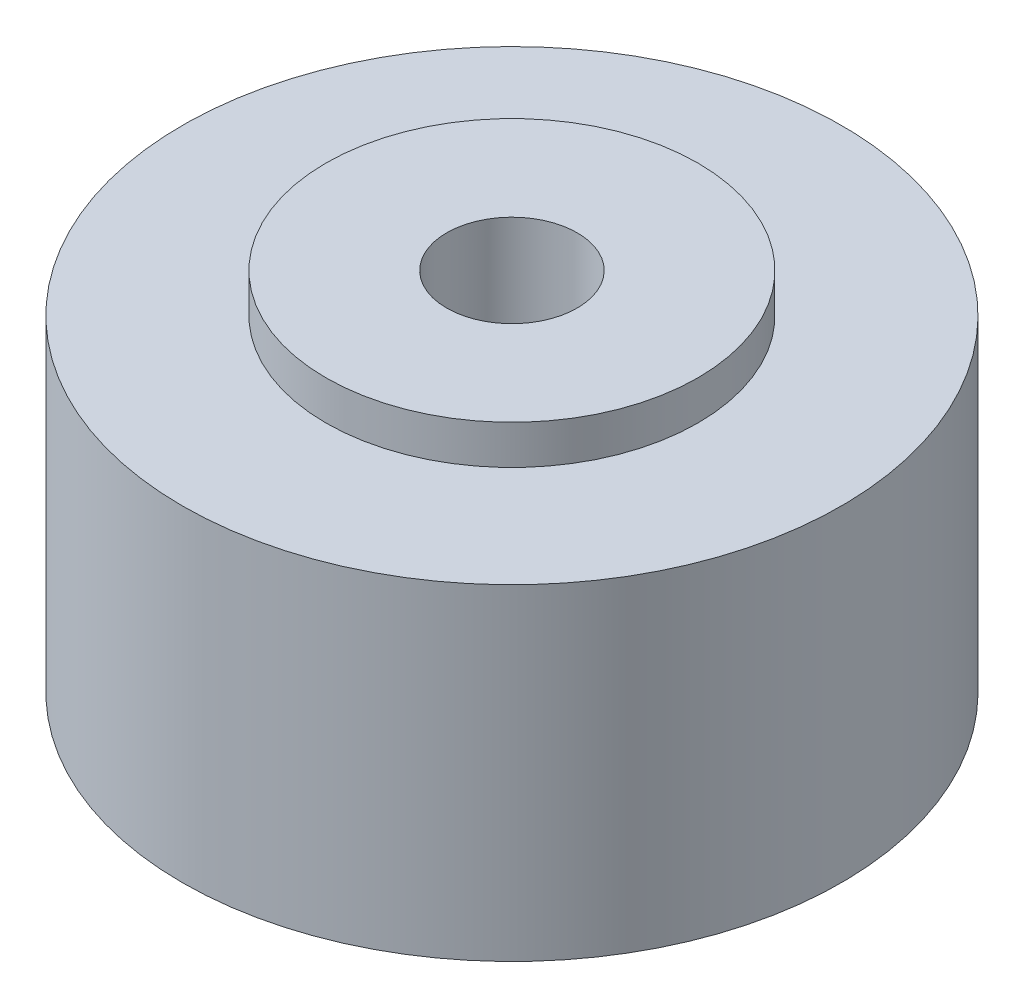
ISO-10303-21;
HEADER;
FILE_DESCRIPTION(('STEP AP214'),'2;1');
FILE_NAME('part.step','',(''),(''),'','','');
FILE_SCHEMA(('AUTOMOTIVE_DESIGN { 1 0 10303 214 1 1 1 1 }'));
ENDSEC;
DATA;
#1=APPLICATION_CONTEXT('core data for automotive mechanical design processes');
#2=APPLICATION_PROTOCOL_DEFINITION('international standard','automotive_design',2000,#1);
#3=PRODUCT_CONTEXT('',#1,'mechanical');
#4=PRODUCT('Part','Part','',(#3));
#5=PRODUCT_RELATED_PRODUCT_CATEGORY('part','',(#4));
#6=PRODUCT_DEFINITION_FORMATION('','',#4);
#7=PRODUCT_DEFINITION_CONTEXT('part definition',#1,'design');
#8=PRODUCT_DEFINITION('design','',#6,#7);
#9=PRODUCT_DEFINITION_SHAPE('','',#8);
#10=(LENGTH_UNIT() NAMED_UNIT(*) SI_UNIT(.MILLI.,.METRE.));
#11=(NAMED_UNIT(*) PLANE_ANGLE_UNIT() SI_UNIT($,.RADIAN.));
#12=(NAMED_UNIT(*) SI_UNIT($,.STERADIAN.) SOLID_ANGLE_UNIT());
#13=UNCERTAINTY_MEASURE_WITH_UNIT(LENGTH_MEASURE(1.E-05),#10,'distance_accuracy_value','');
#14=(GEOMETRIC_REPRESENTATION_CONTEXT(3) GLOBAL_UNCERTAINTY_ASSIGNED_CONTEXT((#13)) GLOBAL_UNIT_ASSIGNED_CONTEXT((#10,
#11,#12)) REPRESENTATION_CONTEXT('',''));
#15=CARTESIAN_POINT('',(0.,0.,0.));
#16=DIRECTION('',(0.,0.,1.));
#17=DIRECTION('',(1.,0.,0.));
#18=AXIS2_PLACEMENT_3D('',#15,#16,#17);
#19=CARTESIAN_POINT('',(0.,0.,0.));
#20=DIRECTION('',(0.,1.,0.));
#21=DIRECTION('',(-1.,0.,0.));
#22=AXIS2_PLACEMENT_3D('',#19,#20,#21);
#23=SPHERICAL_SURFACE('',#22,25.25);
#24=CARTESIAN_POINT('',(0.,24.75,0.));
#25=DIRECTION('',(0.,1.,0.));
#26=DIRECTION('',(0.,0.,1.));
#27=AXIS2_PLACEMENT_3D('',#24,#25,#26);
#28=CIRCLE('',#27,5.);
#29=CARTESIAN_POINT('',(-5.00000000000005,24.75,0.));
#30=VERTEX_POINT('',#29);
#31=EDGE_CURVE('E10',#30,#30,#28,.T.);
#32=CARTESIAN_POINT('',(0.,10.,0.));
#33=DIRECTION('',(0.,1.,0.));
#34=DIRECTION('',(0.,0.,1.));
#35=AXIS2_PLACEMENT_3D('',#32,#33,#34);
#36=CIRCLE('',#35,23.1853941092232);
#37=CARTESIAN_POINT('',(-23.1853941092232,10.,0.));
#38=VERTEX_POINT('',#37);
#39=EDGE_CURVE('E56',#38,#38,#36,.T.);
#40=CARTESIAN_POINT('',(-5.00000000000005,24.75,0.));
#41=CARTESIAN_POINT('',(-5.24859837494411,24.6997793766757,0.));
#42=CARTESIAN_POINT('',(-5.49643953186399,24.6458108524926,0.));
#43=CARTESIAN_POINT('',(-5.99038363063619,24.5304323309131,0.));
#44=CARTESIAN_POINT('',(-6.2364865724885,24.4690223335168,0.));
#45=CARTESIAN_POINT('',(-6.72673046210632,24.3388151940155,0.));
#46=CARTESIAN_POINT('',(-6.97087140987183,24.2700180519107,0.));
#47=CARTESIAN_POINT('',(-7.45696973653403,24.1250994689104,0.));
#48=CARTESIAN_POINT('',(-7.69892711543071,24.048978028015,0.));
#49=CARTESIAN_POINT('',(-8.18043859880342,23.8894798582542,0.));
#50=CARTESIAN_POINT('',(-8.41999270327945,23.8061031293888,0.));
#51=CARTESIAN_POINT('',(-8.8964801446373,23.6321701118176,0.));
#52=CARTESIAN_POINT('',(-9.13341348151913,23.5416138231119,0.));
#53=CARTESIAN_POINT('',(-9.60444426586683,23.3534038977369,0.));
#54=CARTESIAN_POINT('',(-9.8385417133327,23.2557502610677,0.));
#55=CARTESIAN_POINT('',(-10.3036881740102,23.0534343049062,0.));
#56=CARTESIAN_POINT('',(-10.5347371872218,22.9487719854138,0.));
#57=CARTESIAN_POINT('',(-10.9935770017491,22.7325336896755,0.));
#58=CARTESIAN_POINT('',(-11.2213678030647,22.6209577134295,0.));
#59=CARTESIAN_POINT('',(-11.6734843745598,22.3909934080751,0.));
#60=CARTESIAN_POINT('',(-11.8978101447392,22.2726050789667,0.));
#61=CARTESIAN_POINT('',(-12.3427929807033,22.0291235567738,0.));
#62=CARTESIAN_POINT('',(-12.5634500464879,21.9040303636893,0.));
#63=CARTESIAN_POINT('',(-13.0008951313607,21.6472526900602,0.));
#64=CARTESIAN_POINT('',(-13.2176831504488,21.5155682095157,0.));
#65=CARTESIAN_POINT('',(-13.6471933124673,21.2457275219312,0.));
#66=CARTESIAN_POINT('',(-13.8599154553976,21.1075713148913,0.));
#67=CARTESIAN_POINT('',(-14.2811007271919,20.8249126111921,0.));
#68=CARTESIAN_POINT('',(-14.4895638560558,20.6804101145328,0.));
#69=CARTESIAN_POINT('',(-14.9020418287169,20.3851900304893,0.));
#70=CARTESIAN_POINT('',(-15.1060566725141,20.2344724431051,0.));
#71=CARTESIAN_POINT('',(-15.5094528427959,19.9269590194058,0.));
#72=CARTESIAN_POINT('',(-15.7088341692805,19.7701631830906,0.));
#73=CARTESIAN_POINT('',(-16.1027822796243,19.4506356219792,0.));
#74=CARTESIAN_POINT('',(-16.2973490634835,19.2879038971828,0.));
#75=CARTESIAN_POINT('',(-16.6814914345563,18.9566523089604,0.));
#76=CARTESIAN_POINT('',(-16.8710670217699,18.7881324455343,0.));
#77=CARTESIAN_POINT('',(-17.2450548772138,18.4454575851583,0.));
#78=CARTESIAN_POINT('',(-17.4294671454442,18.2713025882083,0.));
#79=CARTESIAN_POINT('',(-17.7929609285432,17.9175155822264,0.));
#80=CARTESIAN_POINT('',(-17.9720424434119,17.7378835731944,0.));
#81=CARTESIAN_POINT('',(-18.3247121253864,17.3733056372613,0.));
#82=CARTESIAN_POINT('',(-18.4983002924922,17.1883597103604,0.));
#83=CARTESIAN_POINT('',(-18.8398256721467,16.8133218575967,0.));
#84=CARTESIAN_POINT('',(-19.0077628846954,16.6232299317341,0.));
#85=CARTESIAN_POINT('',(-19.3378338791292,16.2380726721823,0.));
#86=CARTESIAN_POINT('',(-19.4999676610144,16.0430073384932,0.));
#87=CARTESIAN_POINT('',(-19.8182845871987,15.6480803699759,0.));
#88=CARTESIAN_POINT('',(-19.9744677314977,15.4482187351479,0.));
#89=CARTESIAN_POINT('',(-20.2807415782128,15.043880625693,0.));
#90=CARTESIAN_POINT('',(-20.4308322806288,14.8394041510661,0.));
#91=CARTESIAN_POINT('',(-20.7247849714464,14.42602201362,0.));
#92=CARTESIAN_POINT('',(-20.8686469598479,14.2171163508008,0.));
#93=CARTESIAN_POINT('',(-21.1500116034472,13.7950655089049,0.));
#94=CARTESIAN_POINT('',(-21.287514258645,13.5819203298281,0.));
#95=CARTESIAN_POINT('',(-21.556035399191,13.1515839806161,0.));
#96=CARTESIAN_POINT('',(-21.6870538845391,12.934392810481,0.));
#97=CARTESIAN_POINT('',(-21.9424877035466,12.4961616627015,0.));
#98=CARTESIAN_POINT('',(-22.0669030372058,12.2751216850572,0.));
#99=CARTESIAN_POINT('',(-22.3090176871445,11.8293936568072,0.));
#100=CARTESIAN_POINT('',(-22.426717003424,11.6047056062015,0.));
#101=CARTESIAN_POINT('',(-22.6552923993598,11.1518852678138,0.));
#102=CARTESIAN_POINT('',(-22.7661684790161,10.9237529800319,0.));
#103=CARTESIAN_POINT('',(-22.9809980616462,10.4642519175949,0.));
#104=CARTESIAN_POINT('',(-23.0849515646201,10.2328831429399,0.));
#105=CARTESIAN_POINT('',(-23.1853941092232,10.,0.));
#106=B_SPLINE_CURVE_WITH_KNOTS('',3,(#40,#41,#42,#43,#44,#45,#46,#47,#48,#49,#50,#51,#52,#53,
#54,#55,#56,#57,#58,#59,#60,#61,#62,#63,#64,#65,#66,#67,#68,#69,#70,#71,#72,#73,#74,#75,#76,#77,
#78,#79,#80,#81,#82,#83,#84,#85,#86,#87,#88,#89,#90,#91,#92,#93,#94,#95,#96,#97,#98,#99,#100,
#101,#102,#103,#104,#105),.UNSPECIFIED.,.F.,.F.,(4,2,2,2,2,2,2,2,2,2,2,2,2,2,2,2,2,2,2,2,2,2,2,
2,2,2,2,2,2,2,2,2,4),(0.,0.760832043364048,1.5216640867281,2.28249613009215,3.04332817345619,
3.80416021682024,4.56499226018429,5.32582430354834,6.08665634691239,6.84748839027644,
7.60832043364049,8.36915247700454,9.12998452036858,9.89081656373263,10.6516486070967,
11.4124806504607,12.1733126938248,12.9341447371888,13.6949767805529,14.4558088239169,
15.216640867281,15.977472910645,16.7383049540091,17.4991369973731,18.2599690407372,
19.0208010841012,19.7816331274653,20.5424651708293,21.3032972141934,22.0641292575574,
22.8249613009215,23.5857933442855,24.3466253876496),.UNSPECIFIED.);
#107=EDGE_CURVE('BSEAM31',#30,#38,#106,.T.);
#108=ORIENTED_EDGE('',*,*,#31,.T.);
#109=ORIENTED_EDGE('',*,*,#39,.F.);
#110=ORIENTED_EDGE('',*,*,#107,.T.);
#111=ORIENTED_EDGE('',*,*,#107,.F.);
#112=EDGE_LOOP('',(#108,#110,#109,#111));
#113=FACE_BOUND('',#112,.T.);
#114=ADVANCED_FACE('F31',(#113),#23,.F.);
#115=CARTESIAN_POINT('',(0.,108.106230535638,0.));
#116=DIRECTION('',(0.,1.,0.));
#117=DIRECTION('',(0.,0.,1.));
#118=AXIS2_PLACEMENT_3D('',#115,#116,#117);
#119=CYLINDRICAL_SURFACE('',#118,5.);
#120=CARTESIAN_POINT('',(0.,38.,0.));
#121=DIRECTION('',(0.,1.,0.));
#122=DIRECTION('',(0.,0.,1.));
#123=AXIS2_PLACEMENT_3D('',#120,#121,#122);
#124=CIRCLE('',#123,5.);
#125=CARTESIAN_POINT('',(0.,38.,5.));
#126=VERTEX_POINT('',#125);
#127=EDGE_CURVE('E37',#126,#126,#124,.T.);
#128=ORIENTED_EDGE('',*,*,#127,.T.);
#129=EDGE_LOOP('',(#128));
#130=FACE_BOUND('',#129,.T.);
#131=ORIENTED_EDGE('',*,*,#31,.F.);
#132=EDGE_LOOP('',(#131));
#133=FACE_BOUND('',#132,.T.);
#134=ADVANCED_FACE('F64',(#130,#133),#119,.F.);
#135=CARTESIAN_POINT('',(-14.25,38.,0.));
#136=DIRECTION('',(0.,1.,0.));
#137=DIRECTION('',(0.,0.,1.));
#138=AXIS2_PLACEMENT_3D('',#135,#136,#137);
#139=PLANE('',#138);
#140=CARTESIAN_POINT('',(0.,38.,0.));
#141=DIRECTION('',(0.,1.,0.));
#142=DIRECTION('',(0.,0.,1.));
#143=AXIS2_PLACEMENT_3D('',#140,#141,#142);
#144=CIRCLE('',#143,14.25);
#145=CARTESIAN_POINT('',(0.,38.,14.25));
#146=VERTEX_POINT('',#145);
#147=EDGE_CURVE('E41',#146,#146,#144,.T.);
#148=ORIENTED_EDGE('',*,*,#147,.T.);
#149=EDGE_LOOP('',(#148));
#150=FACE_BOUND('',#149,.T.);
#151=ORIENTED_EDGE('',*,*,#127,.F.);
#152=EDGE_LOOP('',(#151));
#153=FACE_BOUND('',#152,.T.);
#154=ADVANCED_FACE('F68',(#150,#153),#139,.T.);
#155=CARTESIAN_POINT('',(0.,108.106230535638,0.));
#156=DIRECTION('',(0.,1.,0.));
#157=DIRECTION('',(0.,0.,1.));
#158=AXIS2_PLACEMENT_3D('',#155,#156,#157);
#159=CYLINDRICAL_SURFACE('',#158,14.25);
#160=CARTESIAN_POINT('',(0.,35.,0.));
#161=DIRECTION('',(0.,1.,0.));
#162=DIRECTION('',(0.,0.,1.));
#163=AXIS2_PLACEMENT_3D('',#160,#161,#162);
#164=CIRCLE('',#163,14.25);
#165=CARTESIAN_POINT('',(0.,35.,14.25));
#166=VERTEX_POINT('',#165);
#167=EDGE_CURVE('E45',#166,#166,#164,.T.);
#168=ORIENTED_EDGE('',*,*,#167,.T.);
#169=EDGE_LOOP('',(#168));
#170=FACE_BOUND('',#169,.T.);
#171=ORIENTED_EDGE('',*,*,#147,.F.);
#172=EDGE_LOOP('',(#171));
#173=FACE_BOUND('',#172,.T.);
#174=ADVANCED_FACE('F72',(#170,#173),#159,.T.);
#175=CARTESIAN_POINT('',(-25.25,35.,0.));
#176=DIRECTION('',(0.,1.,0.));
#177=DIRECTION('',(0.,0.,1.));
#178=AXIS2_PLACEMENT_3D('',#175,#176,#177);
#179=PLANE('',#178);
#180=CARTESIAN_POINT('',(0.,35.,0.));
#181=DIRECTION('',(0.,1.,0.));
#182=DIRECTION('',(0.,0.,1.));
#183=AXIS2_PLACEMENT_3D('',#180,#181,#182);
#184=CIRCLE('',#183,25.25);
#185=CARTESIAN_POINT('',(0.,35.,25.25));
#186=VERTEX_POINT('',#185);
#187=EDGE_CURVE('E50',#186,#186,#184,.T.);
#188=ORIENTED_EDGE('',*,*,#187,.T.);
#189=EDGE_LOOP('',(#188));
#190=FACE_BOUND('',#189,.T.);
#191=ORIENTED_EDGE('',*,*,#167,.F.);
#192=EDGE_LOOP('',(#191));
#193=FACE_BOUND('',#192,.T.);
#194=ADVANCED_FACE('F79',(#190,#193),#179,.T.);
#195=CARTESIAN_POINT('',(0.,108.106230535638,0.));
#196=DIRECTION('',(0.,1.,0.));
#197=DIRECTION('',(0.,0.,1.));
#198=AXIS2_PLACEMENT_3D('',#195,#196,#197);
#199=CYLINDRICAL_SURFACE('',#198,25.25);
#200=CARTESIAN_POINT('',(0.,9.99999999999999,0.));
#201=DIRECTION('',(0.,1.,0.));
#202=DIRECTION('',(0.,0.,1.));
#203=AXIS2_PLACEMENT_3D('',#200,#201,#202);
#204=CIRCLE('',#203,25.25);
#205=CARTESIAN_POINT('',(0.,9.99999999999999,25.25));
#206=VERTEX_POINT('',#205);
#207=EDGE_CURVE('E53',#206,#206,#204,.T.);
#208=ORIENTED_EDGE('',*,*,#207,.T.);
#209=EDGE_LOOP('',(#208));
#210=FACE_BOUND('',#209,.T.);
#211=ORIENTED_EDGE('',*,*,#187,.F.);
#212=EDGE_LOOP('',(#211));
#213=FACE_BOUND('',#212,.T.);
#214=ADVANCED_FACE('F83',(#210,#213),#199,.T.);
#215=CARTESIAN_POINT('',(-23.1853941092232,10.,0.));
#216=DIRECTION('',(0.,-1.,0.));
#217=DIRECTION('',(0.,0.,-1.));
#218=AXIS2_PLACEMENT_3D('',#215,#216,#217);
#219=PLANE('',#218);
#220=ORIENTED_EDGE('',*,*,#39,.T.);
#221=EDGE_LOOP('',(#220));
#222=FACE_BOUND('',#221,.T.);
#223=ORIENTED_EDGE('',*,*,#207,.F.);
#224=EDGE_LOOP('',(#223));
#225=FACE_BOUND('',#224,.T.);
#226=ADVANCED_FACE('F60',(#222,#225),#219,.T.);
#227=CLOSED_SHELL('',(#114,#134,#154,#174,#194,#214,#226));
#228=MANIFOLD_SOLID_BREP('B2',#227);
#229=ADVANCED_BREP_SHAPE_REPRESENTATION('',(#18,#228),#14);
#230=SHAPE_DEFINITION_REPRESENTATION(#9,#229);
ENDSEC;
END-ISO-10303-21;
